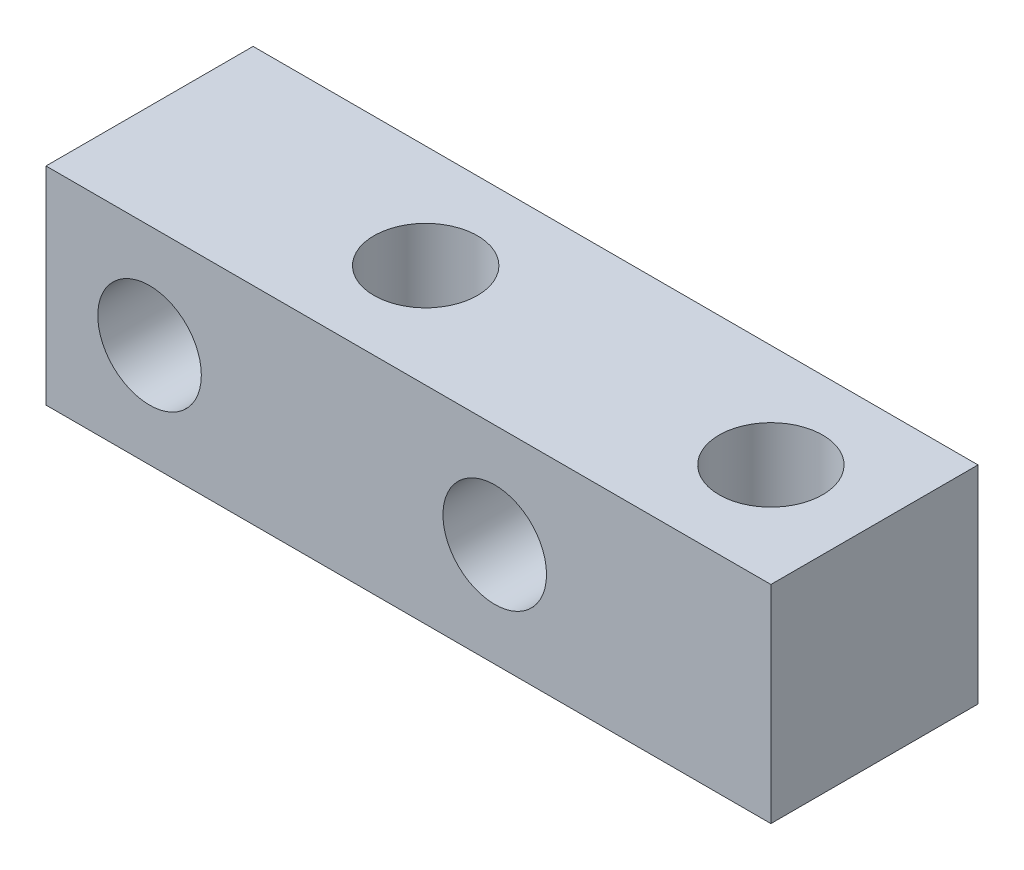
ISO-10303-21;
HEADER;
FILE_DESCRIPTION(('STEP AP214'),'2;1');
FILE_NAME('part.step','',(''),(''),'','','');
FILE_SCHEMA(('AUTOMOTIVE_DESIGN { 1 0 10303 214 1 1 1 1 }'));
ENDSEC;
DATA;
#1=APPLICATION_CONTEXT('core data for automotive mechanical design processes');
#2=APPLICATION_PROTOCOL_DEFINITION('international standard','automotive_design',2000,#1);
#3=PRODUCT_CONTEXT('',#1,'mechanical');
#4=PRODUCT('Part','Part','',(#3));
#5=PRODUCT_RELATED_PRODUCT_CATEGORY('part','',(#4));
#6=PRODUCT_DEFINITION_FORMATION('','',#4);
#7=PRODUCT_DEFINITION_CONTEXT('part definition',#1,'design');
#8=PRODUCT_DEFINITION('design','',#6,#7);
#9=PRODUCT_DEFINITION_SHAPE('','',#8);
#10=(LENGTH_UNIT() NAMED_UNIT(*) SI_UNIT(.MILLI.,.METRE.));
#11=(NAMED_UNIT(*) PLANE_ANGLE_UNIT() SI_UNIT($,.RADIAN.));
#12=(NAMED_UNIT(*) SI_UNIT($,.STERADIAN.) SOLID_ANGLE_UNIT());
#13=UNCERTAINTY_MEASURE_WITH_UNIT(LENGTH_MEASURE(1.E-05),#10,'distance_accuracy_value','');
#14=(GEOMETRIC_REPRESENTATION_CONTEXT(3) GLOBAL_UNCERTAINTY_ASSIGNED_CONTEXT((#13)) GLOBAL_UNIT_ASSIGNED_CONTEXT((#10,
#11,#12)) REPRESENTATION_CONTEXT('',''));
#15=CARTESIAN_POINT('',(0.,0.,0.));
#16=DIRECTION('',(0.,0.,1.));
#17=DIRECTION('',(1.,0.,0.));
#18=AXIS2_PLACEMENT_3D('',#15,#16,#17);
#19=CARTESIAN_POINT('',(0.,0.,6.));
#20=DIRECTION('',(0.,0.,1.));
#21=DIRECTION('',(1.,0.,0.));
#22=AXIS2_PLACEMENT_3D('',#19,#20,#21);
#23=PLANE('',#22);
#24=CARTESIAN_POINT('',(-7.5,0.,6.));
#25=DIRECTION('',(0.,0.,1.));
#26=DIRECTION('',(1.,0.,0.));
#27=AXIS2_PLACEMENT_3D('',#24,#25,#26);
#28=CIRCLE('',#27,1.5);
#29=CARTESIAN_POINT('',(-6.,0.,6.));
#30=VERTEX_POINT('',#29);
#31=EDGE_CURVE('E106',#30,#30,#28,.T.);
#32=ORIENTED_EDGE('',*,*,#31,.F.);
#33=EDGE_LOOP('',(#32));
#34=FACE_BOUND('',#33,.T.);
#35=DIRECTION('',(0.,1.,0.));
#36=VECTOR('',#35,1.);
#37=CARTESIAN_POINT('',(10.5,3.,6.));
#38=LINE('',#37,#36);
#39=CARTESIAN_POINT('',(10.5,-3.,6.));
#40=VERTEX_POINT('',#39);
#41=CARTESIAN_POINT('',(10.5,3.,6.));
#42=VERTEX_POINT('',#41);
#43=EDGE_CURVE('E90',#40,#42,#38,.T.);
#44=ORIENTED_EDGE('',*,*,#43,.T.);
#45=DIRECTION('',(-1.,0.,0.));
#46=VECTOR('',#45,1.);
#47=CARTESIAN_POINT('',(-10.5,3.,6.));
#48=LINE('',#47,#46);
#49=CARTESIAN_POINT('',(-10.5,3.,6.));
#50=VERTEX_POINT('',#49);
#51=EDGE_CURVE('E85',#42,#50,#48,.T.);
#52=ORIENTED_EDGE('',*,*,#51,.T.);
#53=DIRECTION('',(0.,-1.,0.));
#54=VECTOR('',#53,1.);
#55=CARTESIAN_POINT('',(-10.5,3.,6.));
#56=LINE('',#55,#54);
#57=CARTESIAN_POINT('',(-10.5,-3.,6.));
#58=VERTEX_POINT('',#57);
#59=EDGE_CURVE('E88',#50,#58,#56,.T.);
#60=ORIENTED_EDGE('',*,*,#59,.T.);
#61=DIRECTION('',(1.,0.,0.));
#62=VECTOR('',#61,1.);
#63=CARTESIAN_POINT('',(-10.5,-3.,6.));
#64=LINE('',#63,#62);
#65=EDGE_CURVE('E55',#58,#40,#64,.T.);
#66=ORIENTED_EDGE('',*,*,#65,.T.);
#67=EDGE_LOOP('',(#44,#52,#60,#66));
#68=FACE_BOUND('',#67,.T.);
#69=CARTESIAN_POINT('',(2.5,0.,6.));
#70=DIRECTION('',(0.,0.,1.));
#71=DIRECTION('',(1.,0.,0.));
#72=AXIS2_PLACEMENT_3D('',#69,#70,#71);
#73=CIRCLE('',#72,1.5);
#74=CARTESIAN_POINT('',(4.,0.,6.));
#75=VERTEX_POINT('',#74);
#76=EDGE_CURVE('E126',#75,#75,#73,.T.);
#77=ORIENTED_EDGE('',*,*,#76,.F.);
#78=EDGE_LOOP('',(#77));
#79=FACE_BOUND('',#78,.T.);
#80=ADVANCED_FACE('F36',(#34,#68,#79),#23,.T.);
#81=CARTESIAN_POINT('',(0.,0.,0.));
#82=DIRECTION('',(0.,0.,1.));
#83=DIRECTION('',(1.,0.,0.));
#84=AXIS2_PLACEMENT_3D('',#81,#82,#83);
#85=PLANE('',#84);
#86=DIRECTION('',(0.,1.,0.));
#87=VECTOR('',#86,1.);
#88=CARTESIAN_POINT('',(10.5,3.,0.));
#89=LINE('',#88,#87);
#90=CARTESIAN_POINT('',(10.5,-3.,0.));
#91=VERTEX_POINT('',#90);
#92=CARTESIAN_POINT('',(10.5,3.,0.));
#93=VERTEX_POINT('',#92);
#94=EDGE_CURVE('E103',#91,#93,#89,.T.);
#95=ORIENTED_EDGE('',*,*,#94,.F.);
#96=DIRECTION('',(1.,0.,0.));
#97=VECTOR('',#96,1.);
#98=CARTESIAN_POINT('',(-10.5,-3.,0.));
#99=LINE('',#98,#97);
#100=CARTESIAN_POINT('',(-10.5,-3.,0.));
#101=VERTEX_POINT('',#100);
#102=EDGE_CURVE('E78',#101,#91,#99,.T.);
#103=ORIENTED_EDGE('',*,*,#102,.F.);
#104=DIRECTION('',(0.,-1.,0.));
#105=VECTOR('',#104,1.);
#106=CARTESIAN_POINT('',(-10.5,3.,0.));
#107=LINE('',#106,#105);
#108=CARTESIAN_POINT('',(-10.5,3.,0.));
#109=VERTEX_POINT('',#108);
#110=EDGE_CURVE('E72',#109,#101,#107,.T.);
#111=ORIENTED_EDGE('',*,*,#110,.F.);
#112=DIRECTION('',(-1.,0.,0.));
#113=VECTOR('',#112,1.);
#114=CARTESIAN_POINT('',(-10.5,3.,0.));
#115=LINE('',#114,#113);
#116=EDGE_CURVE('E94',#93,#109,#115,.T.);
#117=ORIENTED_EDGE('',*,*,#116,.F.);
#118=EDGE_LOOP('',(#95,#103,#111,#117));
#119=FACE_BOUND('',#118,.T.);
#120=CARTESIAN_POINT('',(-7.5,0.,0.));
#121=DIRECTION('',(0.,0.,1.));
#122=DIRECTION('',(1.,0.,0.));
#123=AXIS2_PLACEMENT_3D('',#120,#121,#122);
#124=CIRCLE('',#123,1.5);
#125=CARTESIAN_POINT('',(-6.,0.,0.));
#126=VERTEX_POINT('',#125);
#127=EDGE_CURVE('E129',#126,#126,#124,.T.);
#128=ORIENTED_EDGE('',*,*,#127,.T.);
#129=EDGE_LOOP('',(#128));
#130=FACE_BOUND('',#129,.T.);
#131=CARTESIAN_POINT('',(2.5,0.,0.));
#132=DIRECTION('',(0.,0.,1.));
#133=DIRECTION('',(1.,0.,0.));
#134=AXIS2_PLACEMENT_3D('',#131,#132,#133);
#135=CIRCLE('',#134,1.5);
#136=CARTESIAN_POINT('',(4.,0.,0.));
#137=VERTEX_POINT('',#136);
#138=EDGE_CURVE('E117',#137,#137,#135,.T.);
#139=ORIENTED_EDGE('',*,*,#138,.T.);
#140=EDGE_LOOP('',(#139));
#141=FACE_BOUND('',#140,.T.);
#142=ADVANCED_FACE('F137',(#119,#130,#141),#85,.F.);
#143=CARTESIAN_POINT('',(10.5,3.,6.));
#144=DIRECTION('',(-1.,0.,0.));
#145=DIRECTION('',(0.,0.,1.));
#146=AXIS2_PLACEMENT_3D('',#143,#144,#145);
#147=PLANE('',#146);
#148=ORIENTED_EDGE('',*,*,#94,.T.);
#149=DIRECTION('',(0.,0.,-1.));
#150=VECTOR('',#149,1.);
#151=CARTESIAN_POINT('',(10.5,3.,6.));
#152=LINE('',#151,#150);
#153=EDGE_CURVE('E11',#42,#93,#152,.T.);
#154=ORIENTED_EDGE('',*,*,#153,.F.);
#155=ORIENTED_EDGE('',*,*,#43,.F.);
#156=DIRECTION('',(0.,0.,-1.));
#157=VECTOR('',#156,1.);
#158=CARTESIAN_POINT('',(10.5,-3.,6.));
#159=LINE('',#158,#157);
#160=EDGE_CURVE('E99',#40,#91,#159,.T.);
#161=ORIENTED_EDGE('',*,*,#160,.T.);
#162=EDGE_LOOP('',(#148,#154,#155,#161));
#163=FACE_BOUND('',#162,.T.);
#164=ADVANCED_FACE('F38',(#163),#147,.F.);
#165=CARTESIAN_POINT('',(-10.5,3.,6.));
#166=DIRECTION('',(0.,-1.,0.));
#167=DIRECTION('',(0.,0.,-1.));
#168=AXIS2_PLACEMENT_3D('',#165,#166,#167);
#169=PLANE('',#168);
#170=CARTESIAN_POINT('',(7.5,3.,3.));
#171=DIRECTION('',(0.,1.,0.));
#172=DIRECTION('',(0.,0.,1.));
#173=AXIS2_PLACEMENT_3D('',#170,#171,#172);
#174=CIRCLE('',#173,1.5);
#175=CARTESIAN_POINT('',(7.5,3.,4.5));
#176=VERTEX_POINT('',#175);
#177=EDGE_CURVE('E113',#176,#176,#174,.T.);
#178=ORIENTED_EDGE('',*,*,#177,.F.);
#179=EDGE_LOOP('',(#178));
#180=FACE_BOUND('',#179,.T.);
#181=CARTESIAN_POINT('',(-2.5,3.,3.));
#182=DIRECTION('',(0.,1.,0.));
#183=DIRECTION('',(0.,0.,1.));
#184=AXIS2_PLACEMENT_3D('',#181,#182,#183);
#185=CIRCLE('',#184,1.5);
#186=CARTESIAN_POINT('',(-2.5,3.,4.5));
#187=VERTEX_POINT('',#186);
#188=EDGE_CURVE('E119',#187,#187,#185,.T.);
#189=ORIENTED_EDGE('',*,*,#188,.F.);
#190=EDGE_LOOP('',(#189));
#191=FACE_BOUND('',#190,.T.);
#192=ORIENTED_EDGE('',*,*,#116,.T.);
#193=DIRECTION('',(0.,0.,-1.));
#194=VECTOR('',#193,1.);
#195=CARTESIAN_POINT('',(-10.5,3.,6.));
#196=LINE('',#195,#194);
#197=EDGE_CURVE('E46',#50,#109,#196,.T.);
#198=ORIENTED_EDGE('',*,*,#197,.F.);
#199=ORIENTED_EDGE('',*,*,#51,.F.);
#200=ORIENTED_EDGE('',*,*,#153,.T.);
#201=EDGE_LOOP('',(#192,#198,#199,#200));
#202=FACE_BOUND('',#201,.T.);
#203=ADVANCED_FACE('F93',(#180,#191,#202),#169,.F.);
#204=CARTESIAN_POINT('',(-10.5,3.,6.));
#205=DIRECTION('',(1.,0.,0.));
#206=DIRECTION('',(0.,0.,-1.));
#207=AXIS2_PLACEMENT_3D('',#204,#205,#206);
#208=PLANE('',#207);
#209=ORIENTED_EDGE('',*,*,#110,.T.);
#210=DIRECTION('',(0.,0.,-1.));
#211=VECTOR('',#210,1.);
#212=CARTESIAN_POINT('',(-10.5,-3.,6.));
#213=LINE('',#212,#211);
#214=EDGE_CURVE('E95',#58,#101,#213,.T.);
#215=ORIENTED_EDGE('',*,*,#214,.F.);
#216=ORIENTED_EDGE('',*,*,#59,.F.);
#217=ORIENTED_EDGE('',*,*,#197,.T.);
#218=EDGE_LOOP('',(#209,#215,#216,#217));
#219=FACE_BOUND('',#218,.T.);
#220=ADVANCED_FACE('F97',(#219),#208,.F.);
#221=CARTESIAN_POINT('',(-10.5,-3.,6.));
#222=DIRECTION('',(0.,1.,0.));
#223=DIRECTION('',(0.,0.,1.));
#224=AXIS2_PLACEMENT_3D('',#221,#222,#223);
#225=PLANE('',#224);
#226=CARTESIAN_POINT('',(7.5,-3.,3.));
#227=DIRECTION('',(0.,1.,0.));
#228=DIRECTION('',(0.,0.,1.));
#229=AXIS2_PLACEMENT_3D('',#226,#227,#228);
#230=CIRCLE('',#229,1.5);
#231=CARTESIAN_POINT('',(7.5,-3.,4.5));
#232=VERTEX_POINT('',#231);
#233=EDGE_CURVE('E40',#232,#232,#230,.T.);
#234=ORIENTED_EDGE('',*,*,#233,.T.);
#235=EDGE_LOOP('',(#234));
#236=FACE_BOUND('',#235,.T.);
#237=CARTESIAN_POINT('',(-2.5,-3.,3.));
#238=DIRECTION('',(0.,1.,0.));
#239=DIRECTION('',(0.,0.,1.));
#240=AXIS2_PLACEMENT_3D('',#237,#238,#239);
#241=CIRCLE('',#240,1.5);
#242=CARTESIAN_POINT('',(-2.5,-3.,4.5));
#243=VERTEX_POINT('',#242);
#244=EDGE_CURVE('E111',#243,#243,#241,.T.);
#245=ORIENTED_EDGE('',*,*,#244,.T.);
#246=EDGE_LOOP('',(#245));
#247=FACE_BOUND('',#246,.T.);
#248=ORIENTED_EDGE('',*,*,#102,.T.);
#249=ORIENTED_EDGE('',*,*,#160,.F.);
#250=ORIENTED_EDGE('',*,*,#65,.F.);
#251=ORIENTED_EDGE('',*,*,#214,.T.);
#252=EDGE_LOOP('',(#248,#249,#250,#251));
#253=FACE_BOUND('',#252,.T.);
#254=ADVANCED_FACE('F143',(#236,#247,#253),#225,.F.);
#255=CARTESIAN_POINT('',(-7.5,0.,6.));
#256=DIRECTION('',(0.,0.,-1.));
#257=DIRECTION('',(-1.,0.,0.));
#258=AXIS2_PLACEMENT_3D('',#255,#256,#257);
#259=CYLINDRICAL_SURFACE('',#258,1.5);
#260=ORIENTED_EDGE('',*,*,#31,.T.);
#261=EDGE_LOOP('',(#260));
#262=FACE_BOUND('',#261,.T.);
#263=ORIENTED_EDGE('',*,*,#127,.F.);
#264=EDGE_LOOP('',(#263));
#265=FACE_BOUND('',#264,.T.);
#266=ADVANCED_FACE('F140',(#262,#265),#259,.F.);
#267=CARTESIAN_POINT('',(2.5,0.,6.));
#268=DIRECTION('',(0.,0.,-1.));
#269=DIRECTION('',(-1.,0.,0.));
#270=AXIS2_PLACEMENT_3D('',#267,#268,#269);
#271=CYLINDRICAL_SURFACE('',#270,1.5);
#272=ORIENTED_EDGE('',*,*,#76,.T.);
#273=EDGE_LOOP('',(#272));
#274=FACE_BOUND('',#273,.T.);
#275=ORIENTED_EDGE('',*,*,#138,.F.);
#276=EDGE_LOOP('',(#275));
#277=FACE_BOUND('',#276,.T.);
#278=ADVANCED_FACE('F142',(#274,#277),#271,.F.);
#279=CARTESIAN_POINT('',(-2.5,-5.,3.));
#280=DIRECTION('',(0.,1.,0.));
#281=DIRECTION('',(0.,0.,1.));
#282=AXIS2_PLACEMENT_3D('',#279,#280,#281);
#283=CYLINDRICAL_SURFACE('',#282,1.5);
#284=ORIENTED_EDGE('',*,*,#188,.T.);
#285=EDGE_LOOP('',(#284));
#286=FACE_BOUND('',#285,.T.);
#287=ORIENTED_EDGE('',*,*,#244,.F.);
#288=EDGE_LOOP('',(#287));
#289=FACE_BOUND('',#288,.T.);
#290=ADVANCED_FACE('F150',(#286,#289),#283,.F.);
#291=CARTESIAN_POINT('',(7.5,-5.,3.));
#292=DIRECTION('',(0.,1.,0.));
#293=DIRECTION('',(0.,0.,1.));
#294=AXIS2_PLACEMENT_3D('',#291,#292,#293);
#295=CYLINDRICAL_SURFACE('',#294,1.5);
#296=ORIENTED_EDGE('',*,*,#177,.T.);
#297=EDGE_LOOP('',(#296));
#298=FACE_BOUND('',#297,.T.);
#299=ORIENTED_EDGE('',*,*,#233,.F.);
#300=EDGE_LOOP('',(#299));
#301=FACE_BOUND('',#300,.T.);
#302=ADVANCED_FACE('F177',(#298,#301),#295,.F.);
#303=CLOSED_SHELL('',(#80,#142,#164,#203,#220,#254,#266,#278,#290,#302));
#304=MANIFOLD_SOLID_BREP('B2',#303);
#305=ADVANCED_BREP_SHAPE_REPRESENTATION('',(#18,#304),#14);
#306=SHAPE_DEFINITION_REPRESENTATION(#9,#305);
ENDSEC;
END-ISO-10303-21;
